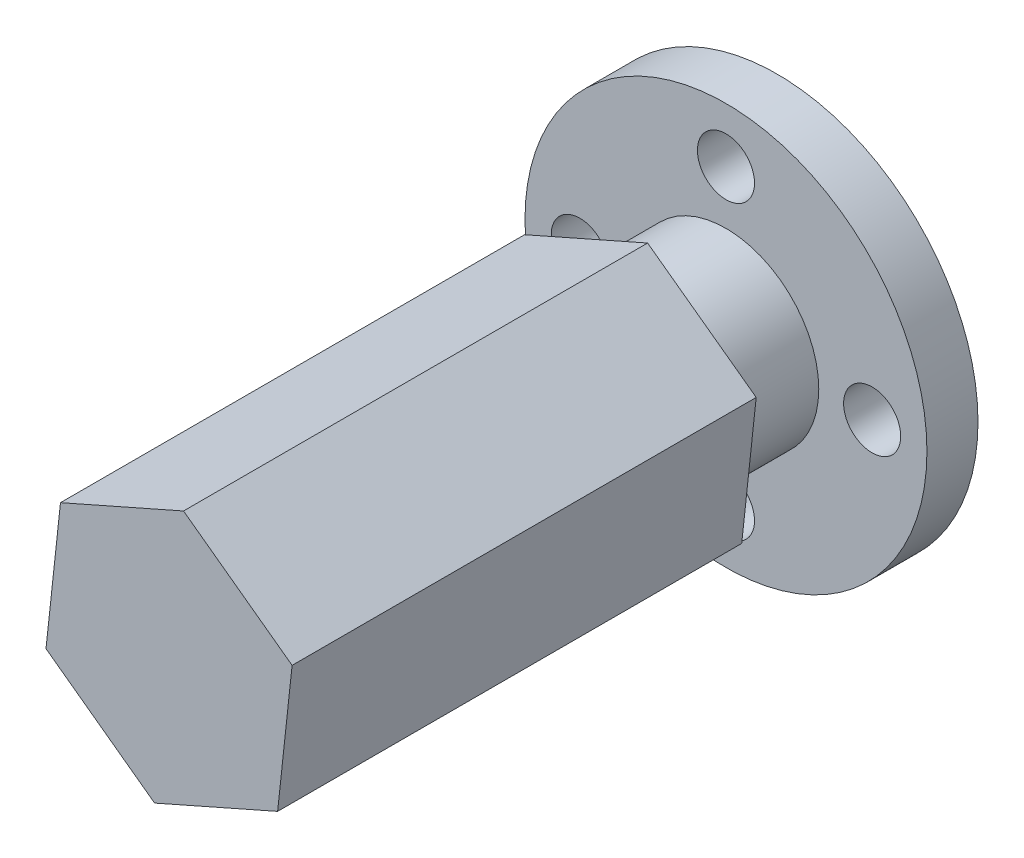
ISO-10303-21;
HEADER;
FILE_DESCRIPTION(('STEP AP214'),'2;1');
FILE_NAME('part.step','',(''),(''),'','','');
FILE_SCHEMA(('AUTOMOTIVE_DESIGN { 1 0 10303 214 1 1 1 1 }'));
ENDSEC;
DATA;
#1=APPLICATION_CONTEXT('core data for automotive mechanical design processes');
#2=APPLICATION_PROTOCOL_DEFINITION('international standard','automotive_design',2000,#1);
#3=PRODUCT_CONTEXT('',#1,'mechanical');
#4=PRODUCT('Part','Part','',(#3));
#5=PRODUCT_RELATED_PRODUCT_CATEGORY('part','',(#4));
#6=PRODUCT_DEFINITION_FORMATION('','',#4);
#7=PRODUCT_DEFINITION_CONTEXT('part definition',#1,'design');
#8=PRODUCT_DEFINITION('design','',#6,#7);
#9=PRODUCT_DEFINITION_SHAPE('','',#8);
#10=(LENGTH_UNIT() NAMED_UNIT(*) SI_UNIT(.MILLI.,.METRE.));
#11=(NAMED_UNIT(*) PLANE_ANGLE_UNIT() SI_UNIT($,.RADIAN.));
#12=(NAMED_UNIT(*) SI_UNIT($,.STERADIAN.) SOLID_ANGLE_UNIT());
#13=UNCERTAINTY_MEASURE_WITH_UNIT(LENGTH_MEASURE(1.E-05),#10,'distance_accuracy_value','');
#14=(GEOMETRIC_REPRESENTATION_CONTEXT(3) GLOBAL_UNCERTAINTY_ASSIGNED_CONTEXT((#13)) GLOBAL_UNIT_ASSIGNED_CONTEXT((#10,
#11,#12)) REPRESENTATION_CONTEXT('',''));
#15=CARTESIAN_POINT('',(0.,0.,0.));
#16=DIRECTION('',(0.,0.,1.));
#17=DIRECTION('',(1.,0.,0.));
#18=AXIS2_PLACEMENT_3D('',#15,#16,#17);
#19=CARTESIAN_POINT('',(-211.672901701734,6.35719781951995,2.794));
#20=DIRECTION('',(0.,0.,1.));
#21=DIRECTION('',(1.,0.,0.));
#22=AXIS2_PLACEMENT_3D('',#19,#20,#21);
#23=PLANE('',#22);
#24=CARTESIAN_POINT('',(-211.672901701734,6.35719781951995,2.794));
#25=DIRECTION('',(0.,0.,1.));
#26=DIRECTION('',(1.,0.,0.));
#27=AXIS2_PLACEMENT_3D('',#24,#25,#26);
#28=CIRCLE('',#27,5.07999999999999);
#29=CARTESIAN_POINT('',(-206.592901701734,6.35719781951995,2.794));
#30=VERTEX_POINT('',#29);
#31=EDGE_CURVE('E138',#30,#30,#28,.T.);
#32=ORIENTED_EDGE('',*,*,#31,.F.);
#33=EDGE_LOOP('',(#32));
#34=FACE_BOUND('',#33,.T.);
#35=CARTESIAN_POINT('',(-203.671901701734,6.35719781951995,2.794));
#36=DIRECTION('',(0.,0.,1.));
#37=DIRECTION('',(1.,0.,0.));
#38=AXIS2_PLACEMENT_3D('',#35,#36,#37);
#39=CIRCLE('',#38,1.56235780999999);
#40=CARTESIAN_POINT('',(-202.109543891734,6.35719781951995,2.794));
#41=VERTEX_POINT('',#40);
#42=EDGE_CURVE('E151',#41,#41,#39,.T.);
#43=ORIENTED_EDGE('',*,*,#42,.F.);
#44=EDGE_LOOP('',(#43));
#45=FACE_BOUND('',#44,.T.);
#46=CARTESIAN_POINT('',(-219.673901701734,6.35719781951995,2.794));
#47=DIRECTION('',(0.,0.,1.));
#48=DIRECTION('',(1.,0.,0.));
#49=AXIS2_PLACEMENT_3D('',#46,#47,#48);
#50=CIRCLE('',#49,1.56235780999999);
#51=CARTESIAN_POINT('',(-218.111543891734,6.35719781951995,2.794));
#52=VERTEX_POINT('',#51);
#53=EDGE_CURVE('E163',#52,#52,#50,.T.);
#54=ORIENTED_EDGE('',*,*,#53,.F.);
#55=EDGE_LOOP('',(#54));
#56=FACE_BOUND('',#55,.T.);
#57=CARTESIAN_POINT('',(-211.672901701734,6.35719781951995,2.794));
#58=DIRECTION('',(0.,0.,1.));
#59=DIRECTION('',(1.,0.,0.));
#60=AXIS2_PLACEMENT_3D('',#57,#58,#59);
#61=CIRCLE('',#60,11.000000098);
#62=CARTESIAN_POINT('',(-200.672901603734,6.35719781951995,2.794));
#63=VERTEX_POINT('',#62);
#64=EDGE_CURVE('E11',#63,#63,#61,.T.);
#65=ORIENTED_EDGE('',*,*,#64,.T.);
#66=EDGE_LOOP('',(#65));
#67=FACE_BOUND('',#66,.T.);
#68=CARTESIAN_POINT('',(-211.672901701734,14.35819781952,2.794));
#69=DIRECTION('',(0.,0.,1.));
#70=DIRECTION('',(1.,0.,0.));
#71=AXIS2_PLACEMENT_3D('',#68,#69,#70);
#72=CIRCLE('',#71,1.56235780999999);
#73=CARTESIAN_POINT('',(-210.110543891734,14.35819781952,2.794));
#74=VERTEX_POINT('',#73);
#75=EDGE_CURVE('E169',#74,#74,#72,.T.);
#76=ORIENTED_EDGE('',*,*,#75,.F.);
#77=EDGE_LOOP('',(#76));
#78=FACE_BOUND('',#77,.T.);
#79=CARTESIAN_POINT('',(-211.672901701734,-1.64380218048005,2.794));
#80=DIRECTION('',(0.,0.,1.));
#81=DIRECTION('',(1.,0.,0.));
#82=AXIS2_PLACEMENT_3D('',#79,#80,#81);
#83=CIRCLE('',#82,1.56235780999999);
#84=CARTESIAN_POINT('',(-210.110543891734,-1.64380218048005,2.794));
#85=VERTEX_POINT('',#84);
#86=EDGE_CURVE('E157',#85,#85,#83,.T.);
#87=ORIENTED_EDGE('',*,*,#86,.F.);
#88=EDGE_LOOP('',(#87));
#89=FACE_BOUND('',#88,.T.);
#90=ADVANCED_FACE('F33',(#34,#45,#56,#67,#78,#89),#23,.T.);
#91=CARTESIAN_POINT('',(-211.672901701734,6.35719781951995,0.));
#92=DIRECTION('',(0.,0.,1.));
#93=DIRECTION('',(1.,0.,0.));
#94=AXIS2_PLACEMENT_3D('',#91,#92,#93);
#95=PLANE('',#94);
#96=CARTESIAN_POINT('',(-211.672901701734,6.35719781951995,0.));
#97=DIRECTION('',(0.,0.,1.));
#98=DIRECTION('',(1.,0.,0.));
#99=AXIS2_PLACEMENT_3D('',#96,#97,#98);
#100=CIRCLE('',#99,11.000000098);
#101=CARTESIAN_POINT('',(-200.672901603734,6.35719781951995,0.));
#102=VERTEX_POINT('',#101);
#103=EDGE_CURVE('E37',#102,#102,#100,.T.);
#104=ORIENTED_EDGE('',*,*,#103,.F.);
#105=EDGE_LOOP('',(#104));
#106=FACE_BOUND('',#105,.T.);
#107=CARTESIAN_POINT('',(-211.672901701734,14.35819781952,0.));
#108=DIRECTION('',(0.,0.,1.));
#109=DIRECTION('',(1.,0.,0.));
#110=AXIS2_PLACEMENT_3D('',#107,#108,#109);
#111=CIRCLE('',#110,1.56235780999999);
#112=CARTESIAN_POINT('',(-210.110543891734,14.35819781952,0.));
#113=VERTEX_POINT('',#112);
#114=EDGE_CURVE('E166',#113,#113,#111,.T.);
#115=ORIENTED_EDGE('',*,*,#114,.T.);
#116=EDGE_LOOP('',(#115));
#117=FACE_BOUND('',#116,.T.);
#118=CARTESIAN_POINT('',(-219.673901701734,6.35719781951995,0.));
#119=DIRECTION('',(0.,0.,1.));
#120=DIRECTION('',(1.,0.,0.));
#121=AXIS2_PLACEMENT_3D('',#118,#119,#120);
#122=CIRCLE('',#121,1.56235780999999);
#123=CARTESIAN_POINT('',(-218.111543891734,6.35719781951995,0.));
#124=VERTEX_POINT('',#123);
#125=EDGE_CURVE('E160',#124,#124,#122,.T.);
#126=ORIENTED_EDGE('',*,*,#125,.T.);
#127=EDGE_LOOP('',(#126));
#128=FACE_BOUND('',#127,.T.);
#129=CARTESIAN_POINT('',(-211.672901701734,-1.64380218048005,0.));
#130=DIRECTION('',(0.,0.,1.));
#131=DIRECTION('',(1.,0.,0.));
#132=AXIS2_PLACEMENT_3D('',#129,#130,#131);
#133=CIRCLE('',#132,1.56235780999999);
#134=CARTESIAN_POINT('',(-210.110543891734,-1.64380218048005,0.));
#135=VERTEX_POINT('',#134);
#136=EDGE_CURVE('E154',#135,#135,#133,.T.);
#137=ORIENTED_EDGE('',*,*,#136,.T.);
#138=EDGE_LOOP('',(#137));
#139=FACE_BOUND('',#138,.T.);
#140=CARTESIAN_POINT('',(-203.671901701734,6.35719781951995,0.));
#141=DIRECTION('',(0.,0.,1.));
#142=DIRECTION('',(1.,0.,0.));
#143=AXIS2_PLACEMENT_3D('',#140,#141,#142);
#144=CIRCLE('',#143,1.56235780999999);
#145=CARTESIAN_POINT('',(-202.109543891734,6.35719781951995,0.));
#146=VERTEX_POINT('',#145);
#147=EDGE_CURVE('E150',#146,#146,#144,.T.);
#148=ORIENTED_EDGE('',*,*,#147,.T.);
#149=EDGE_LOOP('',(#148));
#150=FACE_BOUND('',#149,.T.);
#151=CARTESIAN_POINT('',(-211.672901701734,6.35719781951995,0.));
#152=DIRECTION('',(0.,0.,1.));
#153=DIRECTION('',(1.,0.,0.));
#154=AXIS2_PLACEMENT_3D('',#151,#152,#153);
#155=CIRCLE('',#154,4.19844220000001);
#156=CARTESIAN_POINT('',(-207.474459501734,6.35719781951995,0.));
#157=VERTEX_POINT('',#156);
#158=EDGE_CURVE('E147',#157,#157,#155,.T.);
#159=ORIENTED_EDGE('',*,*,#158,.T.);
#160=EDGE_LOOP('',(#159));
#161=FACE_BOUND('',#160,.T.);
#162=ADVANCED_FACE('F175',(#106,#117,#128,#139,#150,#161),#95,.F.);
#163=CARTESIAN_POINT('',(-211.672901701734,6.35719781951995,2.794));
#164=DIRECTION('',(0.,0.,-1.));
#165=DIRECTION('',(-1.,0.,0.));
#166=AXIS2_PLACEMENT_3D('',#163,#164,#165);
#167=CYLINDRICAL_SURFACE('',#166,11.000000098);
#168=ORIENTED_EDGE('',*,*,#64,.F.);
#169=EDGE_LOOP('',(#168));
#170=FACE_BOUND('',#169,.T.);
#171=ORIENTED_EDGE('',*,*,#103,.T.);
#172=EDGE_LOOP('',(#171));
#173=FACE_BOUND('',#172,.T.);
#174=ADVANCED_FACE('F35',(#170,#173),#167,.T.);
#175=CARTESIAN_POINT('',(-211.672901701734,14.35819781952,2.794));
#176=DIRECTION('',(0.,0.,-1.));
#177=DIRECTION('',(-1.,0.,0.));
#178=AXIS2_PLACEMENT_3D('',#175,#176,#177);
#179=CYLINDRICAL_SURFACE('',#178,1.56235780999999);
#180=ORIENTED_EDGE('',*,*,#75,.T.);
#181=EDGE_LOOP('',(#180));
#182=FACE_BOUND('',#181,.T.);
#183=ORIENTED_EDGE('',*,*,#114,.F.);
#184=EDGE_LOOP('',(#183));
#185=FACE_BOUND('',#184,.T.);
#186=ADVANCED_FACE('F178',(#182,#185),#179,.F.);
#187=CARTESIAN_POINT('',(-219.673901701734,6.35719781951995,2.794));
#188=DIRECTION('',(0.,0.,-1.));
#189=DIRECTION('',(-1.,0.,0.));
#190=AXIS2_PLACEMENT_3D('',#187,#188,#189);
#191=CYLINDRICAL_SURFACE('',#190,1.56235780999999);
#192=ORIENTED_EDGE('',*,*,#53,.T.);
#193=EDGE_LOOP('',(#192));
#194=FACE_BOUND('',#193,.T.);
#195=ORIENTED_EDGE('',*,*,#125,.F.);
#196=EDGE_LOOP('',(#195));
#197=FACE_BOUND('',#196,.T.);
#198=ADVANCED_FACE('F180',(#194,#197),#191,.F.);
#199=CARTESIAN_POINT('',(-211.672901701734,-1.64380218048005,2.794));
#200=DIRECTION('',(0.,0.,-1.));
#201=DIRECTION('',(-1.,0.,0.));
#202=AXIS2_PLACEMENT_3D('',#199,#200,#201);
#203=CYLINDRICAL_SURFACE('',#202,1.56235780999999);
#204=ORIENTED_EDGE('',*,*,#86,.T.);
#205=EDGE_LOOP('',(#204));
#206=FACE_BOUND('',#205,.T.);
#207=ORIENTED_EDGE('',*,*,#136,.F.);
#208=EDGE_LOOP('',(#207));
#209=FACE_BOUND('',#208,.T.);
#210=ADVANCED_FACE('F187',(#206,#209),#203,.F.);
#211=CARTESIAN_POINT('',(-203.671901701734,6.35719781951995,2.794));
#212=DIRECTION('',(0.,0.,-1.));
#213=DIRECTION('',(-1.,0.,0.));
#214=AXIS2_PLACEMENT_3D('',#211,#212,#213);
#215=CYLINDRICAL_SURFACE('',#214,1.56235780999999);
#216=ORIENTED_EDGE('',*,*,#42,.T.);
#217=EDGE_LOOP('',(#216));
#218=FACE_BOUND('',#217,.T.);
#219=ORIENTED_EDGE('',*,*,#147,.F.);
#220=EDGE_LOOP('',(#219));
#221=FACE_BOUND('',#220,.T.);
#222=ADVANCED_FACE('F212',(#218,#221),#215,.F.);
#223=CARTESIAN_POINT('',(-211.672901701734,6.35719781951995,2.794));
#224=DIRECTION('',(0.,0.,-1.));
#225=DIRECTION('',(-1.,0.,0.));
#226=AXIS2_PLACEMENT_3D('',#223,#224,#225);
#227=CYLINDRICAL_SURFACE('',#226,4.19844220000001);
#228=CARTESIAN_POINT('',(-211.672901701734,6.35719781951995,2.794));
#229=DIRECTION('',(0.,0.,1.));
#230=DIRECTION('',(1.,0.,0.));
#231=AXIS2_PLACEMENT_3D('',#228,#229,#230);
#232=CIRCLE('',#231,4.19844220000001);
#233=CARTESIAN_POINT('',(-207.474459501734,6.35719781951995,2.794));
#234=VERTEX_POINT('',#233);
#235=EDGE_CURVE('E142',#234,#234,#232,.T.);
#236=ORIENTED_EDGE('',*,*,#235,.T.);
#237=EDGE_LOOP('',(#236));
#238=FACE_BOUND('',#237,.T.);
#239=ORIENTED_EDGE('',*,*,#158,.F.);
#240=EDGE_LOOP('',(#239));
#241=FACE_BOUND('',#240,.T.);
#242=ADVANCED_FACE('F221',(#238,#241),#227,.F.);
#243=CARTESIAN_POINT('',(-211.672901701734,6.35719781951995,2.794));
#244=DIRECTION('',(0.,0.,1.));
#245=DIRECTION('',(1.,0.,0.));
#246=AXIS2_PLACEMENT_3D('',#243,#244,#245);
#247=PLANE('',#246);
#248=ORIENTED_EDGE('',*,*,#235,.F.);
#249=EDGE_LOOP('',(#248));
#250=FACE_BOUND('',#249,.T.);
#251=ADVANCED_FACE('F223',(#250),#247,.F.);
#252=CARTESIAN_POINT('',(-211.672901701734,6.35719781951995,7.874));
#253=DIRECTION('',(0.,0.,-1.));
#254=DIRECTION('',(-1.,0.,0.));
#255=AXIS2_PLACEMENT_3D('',#252,#253,#254);
#256=CYLINDRICAL_SURFACE('',#255,5.07999999999999);
#257=CARTESIAN_POINT('',(-211.672901701734,6.35719781951995,7.874));
#258=DIRECTION('',(0.,0.,1.));
#259=DIRECTION('',(1.,0.,0.));
#260=AXIS2_PLACEMENT_3D('',#257,#258,#259);
#261=CIRCLE('',#260,5.07999999999999);
#262=CARTESIAN_POINT('',(-206.592901701734,6.35719781951995,7.874));
#263=VERTEX_POINT('',#262);
#264=EDGE_CURVE('E139',#263,#263,#261,.T.);
#265=ORIENTED_EDGE('',*,*,#264,.F.);
#266=EDGE_LOOP('',(#265));
#267=FACE_BOUND('',#266,.T.);
#268=ORIENTED_EDGE('',*,*,#31,.T.);
#269=EDGE_LOOP('',(#268));
#270=FACE_BOUND('',#269,.T.);
#271=ADVANCED_FACE('F230',(#267,#270),#256,.T.);
#272=CARTESIAN_POINT('',(-218.407574372518,3.3842389851682,33.274));
#273=DIRECTION('',(0.994186002535333,-0.107676331488467,0.));
#274=DIRECTION('',(0.107676331488467,0.994186002535333,0.));
#275=AXIS2_PLACEMENT_3D('',#272,#273,#274);
#276=PLANE('',#275);
#277=DIRECTION('',(-0.107676331488467,-0.994186002535333,0.));
#278=VECTOR('',#277,1.);
#279=CARTESIAN_POINT('',(-218.407574372518,3.3842389851682,7.874));
#280=LINE('',#279,#278);
#281=CARTESIAN_POINT('',(-217.614895912081,10.7031160214144,7.874));
#282=VERTEX_POINT('',#281);
#283=CARTESIAN_POINT('',(-218.407574372518,3.3842389851682,7.874));
#284=VERTEX_POINT('',#283);
#285=EDGE_CURVE('E119',#282,#284,#280,.T.);
#286=ORIENTED_EDGE('',*,*,#285,.T.);
#287=DIRECTION('',(0.,0.,-1.));
#288=VECTOR('',#287,1.);
#289=CARTESIAN_POINT('',(-218.407574372518,3.3842389851682,33.274));
#290=LINE('',#289,#288);
#291=CARTESIAN_POINT('',(-218.407574372518,3.3842389851682,33.274));
#292=VERTEX_POINT('',#291);
#293=EDGE_CURVE('E136',#292,#284,#290,.T.);
#294=ORIENTED_EDGE('',*,*,#293,.F.);
#295=DIRECTION('',(-0.107676331488467,-0.994186002535333,0.));
#296=VECTOR('',#295,1.);
#297=CARTESIAN_POINT('',(-218.407574372518,3.3842389851682,33.274));
#298=LINE('',#297,#296);
#299=CARTESIAN_POINT('',(-217.614895912081,10.7031160214144,33.274));
#300=VERTEX_POINT('',#299);
#301=EDGE_CURVE('E129',#300,#292,#298,.T.);
#302=ORIENTED_EDGE('',*,*,#301,.F.);
#303=DIRECTION('',(0.,0.,-1.));
#304=VECTOR('',#303,1.);
#305=CARTESIAN_POINT('',(-217.614895912081,10.7031160214144,33.274));
#306=LINE('',#305,#304);
#307=EDGE_CURVE('E115',#300,#282,#306,.T.);
#308=ORIENTED_EDGE('',*,*,#307,.T.);
#309=EDGE_LOOP('',(#286,#294,#302,#308));
#310=FACE_BOUND('',#309,.T.);
#311=ADVANCED_FACE('F237',(#310),#276,.F.);
#312=CARTESIAN_POINT('',(-212.465580162173,-0.961679216726452,33.274));
#313=DIRECTION('',(0.590343439722991,0.807152168538267,0.));
#314=DIRECTION('',(-0.807152168538267,0.590343439722991,0.));
#315=AXIS2_PLACEMENT_3D('',#312,#313,#314);
#316=PLANE('',#315);
#317=DIRECTION('',(0.807152168538267,-0.590343439722991,0.));
#318=VECTOR('',#317,1.);
#319=CARTESIAN_POINT('',(-212.465580162173,-0.961679216726452,7.874));
#320=LINE('',#319,#318);
#321=CARTESIAN_POINT('',(-212.465580162173,-0.961679216726452,7.874));
#322=VERTEX_POINT('',#321);
#323=EDGE_CURVE('E122',#284,#322,#320,.T.);
#324=ORIENTED_EDGE('',*,*,#323,.T.);
#325=DIRECTION('',(0.,0.,-1.));
#326=VECTOR('',#325,1.);
#327=CARTESIAN_POINT('',(-212.465580162173,-0.961679216726452,33.274));
#328=LINE('',#327,#326);
#329=CARTESIAN_POINT('',(-212.465580162173,-0.961679216726452,33.274));
#330=VERTEX_POINT('',#329);
#331=EDGE_CURVE('E133',#330,#322,#328,.T.);
#332=ORIENTED_EDGE('',*,*,#331,.F.);
#333=DIRECTION('',(0.807152168538267,-0.590343439722991,0.));
#334=VECTOR('',#333,1.);
#335=CARTESIAN_POINT('',(-212.465580162173,-0.961679216726452,33.274));
#336=LINE('',#335,#334);
#337=EDGE_CURVE('E88',#292,#330,#336,.T.);
#338=ORIENTED_EDGE('',*,*,#337,.F.);
#339=ORIENTED_EDGE('',*,*,#293,.T.);
#340=EDGE_LOOP('',(#324,#332,#338,#339));
#341=FACE_BOUND('',#340,.T.);
#342=ADVANCED_FACE('F242',(#341),#316,.F.);
#343=CARTESIAN_POINT('',(-205.73090749139,2.0112796176251,33.274));
#344=DIRECTION('',(-0.403842562812342,0.914828500026731,0.));
#345=DIRECTION('',(-0.914828500026731,-0.403842562812342,0.));
#346=AXIS2_PLACEMENT_3D('',#343,#344,#345);
#347=PLANE('',#346);
#348=DIRECTION('',(0.914828500026731,0.403842562812342,0.));
#349=VECTOR('',#348,1.);
#350=CARTESIAN_POINT('',(-205.73090749139,2.0112796176251,7.874));
#351=LINE('',#350,#349);
#352=CARTESIAN_POINT('',(-205.73090749139,2.0112796176251,7.874));
#353=VERTEX_POINT('',#352);
#354=EDGE_CURVE('E124',#322,#353,#351,.T.);
#355=ORIENTED_EDGE('',*,*,#354,.T.);
#356=DIRECTION('',(0.,0.,-1.));
#357=VECTOR('',#356,1.);
#358=CARTESIAN_POINT('',(-205.73090749139,2.0112796176251,33.274));
#359=LINE('',#358,#357);
#360=CARTESIAN_POINT('',(-205.73090749139,2.0112796176251,33.274));
#361=VERTEX_POINT('',#360);
#362=EDGE_CURVE('E110',#361,#353,#359,.T.);
#363=ORIENTED_EDGE('',*,*,#362,.F.);
#364=DIRECTION('',(0.914828500026731,0.403842562812342,0.));
#365=VECTOR('',#364,1.);
#366=CARTESIAN_POINT('',(-205.73090749139,2.0112796176251,33.274));
#367=LINE('',#366,#365);
#368=EDGE_CURVE('E101',#330,#361,#367,.T.);
#369=ORIENTED_EDGE('',*,*,#368,.F.);
#370=ORIENTED_EDGE('',*,*,#331,.T.);
#371=EDGE_LOOP('',(#355,#363,#369,#370));
#372=FACE_BOUND('',#371,.T.);
#373=ADVANCED_FACE('F246',(#372),#347,.F.);
#374=CARTESIAN_POINT('',(-204.938229030953,9.33015665387128,33.274));
#375=DIRECTION('',(-0.994186002535333,0.107676331488468,0.));
#376=DIRECTION('',(-0.107676331488468,-0.994186002535333,0.));
#377=AXIS2_PLACEMENT_3D('',#374,#375,#376);
#378=PLANE('',#377);
#379=DIRECTION('',(0.107676331488468,0.994186002535333,0.));
#380=VECTOR('',#379,1.);
#381=CARTESIAN_POINT('',(-204.938229030953,9.33015665387128,7.874));
#382=LINE('',#381,#380);
#383=CARTESIAN_POINT('',(-204.938229030953,9.33015665387128,7.874));
#384=VERTEX_POINT('',#383);
#385=EDGE_CURVE('E109',#353,#384,#382,.T.);
#386=ORIENTED_EDGE('',*,*,#385,.T.);
#387=DIRECTION('',(0.,0.,-1.));
#388=VECTOR('',#387,1.);
#389=CARTESIAN_POINT('',(-204.938229030953,9.33015665387128,33.274));
#390=LINE('',#389,#388);
#391=CARTESIAN_POINT('',(-204.938229030953,9.33015665387128,33.274));
#392=VERTEX_POINT('',#391);
#393=EDGE_CURVE('E106',#392,#384,#390,.T.);
#394=ORIENTED_EDGE('',*,*,#393,.F.);
#395=DIRECTION('',(0.107676331488468,0.994186002535333,0.));
#396=VECTOR('',#395,1.);
#397=CARTESIAN_POINT('',(-204.938229030953,9.33015665387128,33.274));
#398=LINE('',#397,#396);
#399=EDGE_CURVE('E95',#361,#392,#398,.T.);
#400=ORIENTED_EDGE('',*,*,#399,.F.);
#401=ORIENTED_EDGE('',*,*,#362,.T.);
#402=EDGE_LOOP('',(#386,#394,#400,#401));
#403=FACE_BOUND('',#402,.T.);
#404=ADVANCED_FACE('F107',(#403),#378,.F.);
#405=CARTESIAN_POINT('',(-210.880223241298,13.676074855766,33.274));
#406=DIRECTION('',(-0.590343439722991,-0.807152168538267,0.));
#407=DIRECTION('',(0.807152168538267,-0.590343439722991,0.));
#408=AXIS2_PLACEMENT_3D('',#405,#406,#407);
#409=PLANE('',#408);
#410=DIRECTION('',(-0.807152168538267,0.590343439722991,0.));
#411=VECTOR('',#410,1.);
#412=CARTESIAN_POINT('',(-210.880223241298,13.676074855766,7.874));
#413=LINE('',#412,#411);
#414=CARTESIAN_POINT('',(-210.880223241298,13.676074855766,7.874));
#415=VERTEX_POINT('',#414);
#416=EDGE_CURVE('E73',#384,#415,#413,.T.);
#417=ORIENTED_EDGE('',*,*,#416,.T.);
#418=DIRECTION('',(0.,0.,-1.));
#419=VECTOR('',#418,1.);
#420=CARTESIAN_POINT('',(-210.880223241298,13.676074855766,33.274));
#421=LINE('',#420,#419);
#422=CARTESIAN_POINT('',(-210.880223241298,13.676074855766,33.274));
#423=VERTEX_POINT('',#422);
#424=EDGE_CURVE('E111',#423,#415,#421,.T.);
#425=ORIENTED_EDGE('',*,*,#424,.F.);
#426=DIRECTION('',(-0.807152168538267,0.590343439722991,0.));
#427=VECTOR('',#426,1.);
#428=CARTESIAN_POINT('',(-210.880223241298,13.676074855766,33.274));
#429=LINE('',#428,#427);
#430=EDGE_CURVE('E99',#392,#423,#429,.T.);
#431=ORIENTED_EDGE('',*,*,#430,.F.);
#432=ORIENTED_EDGE('',*,*,#393,.T.);
#433=EDGE_LOOP('',(#417,#425,#431,#432));
#434=FACE_BOUND('',#433,.T.);
#435=ADVANCED_FACE('F113',(#434),#409,.F.);
#436=CARTESIAN_POINT('',(-217.614895912081,10.7031160214144,33.274));
#437=DIRECTION('',(0.403842562812342,-0.914828500026732,0.));
#438=DIRECTION('',(0.914828500026732,0.403842562812342,0.));
#439=AXIS2_PLACEMENT_3D('',#436,#437,#438);
#440=PLANE('',#439);
#441=DIRECTION('',(-0.914828500026731,-0.403842562812342,0.));
#442=VECTOR('',#441,1.);
#443=CARTESIAN_POINT('',(-217.614895912081,10.7031160214144,7.874));
#444=LINE('',#443,#442);
#445=EDGE_CURVE('E79',#415,#282,#444,.T.);
#446=ORIENTED_EDGE('',*,*,#445,.T.);
#447=ORIENTED_EDGE('',*,*,#307,.F.);
#448=DIRECTION('',(-0.914828500026731,-0.403842562812342,0.));
#449=VECTOR('',#448,1.);
#450=CARTESIAN_POINT('',(-217.614895912081,10.7031160214144,33.274));
#451=LINE('',#450,#449);
#452=EDGE_CURVE('E50',#423,#300,#451,.T.);
#453=ORIENTED_EDGE('',*,*,#452,.F.);
#454=ORIENTED_EDGE('',*,*,#424,.T.);
#455=EDGE_LOOP('',(#446,#447,#453,#454));
#456=FACE_BOUND('',#455,.T.);
#457=ADVANCED_FACE('F254',(#456),#440,.F.);
#458=CARTESIAN_POINT('',(0.,0.,33.274));
#459=DIRECTION('',(0.,0.,-1.));
#460=DIRECTION('',(-1.,0.,0.));
#461=AXIS2_PLACEMENT_3D('',#458,#459,#460);
#462=PLANE('',#461);
#463=ORIENTED_EDGE('',*,*,#301,.T.);
#464=ORIENTED_EDGE('',*,*,#337,.T.);
#465=ORIENTED_EDGE('',*,*,#368,.T.);
#466=ORIENTED_EDGE('',*,*,#399,.T.);
#467=ORIENTED_EDGE('',*,*,#430,.T.);
#468=ORIENTED_EDGE('',*,*,#452,.T.);
#469=EDGE_LOOP('',(#463,#464,#465,#466,#467,#468));
#470=FACE_BOUND('',#469,.T.);
#471=ADVANCED_FACE('F97',(#470),#462,.F.);
#472=CARTESIAN_POINT('',(0.,0.,7.874));
#473=DIRECTION('',(0.,0.,-1.));
#474=DIRECTION('',(-1.,0.,0.));
#475=AXIS2_PLACEMENT_3D('',#472,#473,#474);
#476=PLANE('',#475);
#477=ORIENTED_EDGE('',*,*,#264,.T.);
#478=EDGE_LOOP('',(#477));
#479=FACE_BOUND('',#478,.T.);
#480=ORIENTED_EDGE('',*,*,#285,.F.);
#481=ORIENTED_EDGE('',*,*,#445,.F.);
#482=ORIENTED_EDGE('',*,*,#416,.F.);
#483=ORIENTED_EDGE('',*,*,#385,.F.);
#484=ORIENTED_EDGE('',*,*,#354,.F.);
#485=ORIENTED_EDGE('',*,*,#323,.F.);
#486=EDGE_LOOP('',(#480,#481,#482,#483,#484,#485));
#487=FACE_BOUND('',#486,.T.);
#488=ADVANCED_FACE('F257',(#479,#487),#476,.T.);
#489=CLOSED_SHELL('',(#90,#162,#174,#186,#198,#210,#222,#242,#251,#271,#311,#342,#373,#404,#435,
#457,#471,#488));
#490=MANIFOLD_SOLID_BREP('B2',#489);
#491=ADVANCED_BREP_SHAPE_REPRESENTATION('',(#18,#490),#14);
#492=SHAPE_DEFINITION_REPRESENTATION(#9,#491);
ENDSEC;
END-ISO-10303-21;
